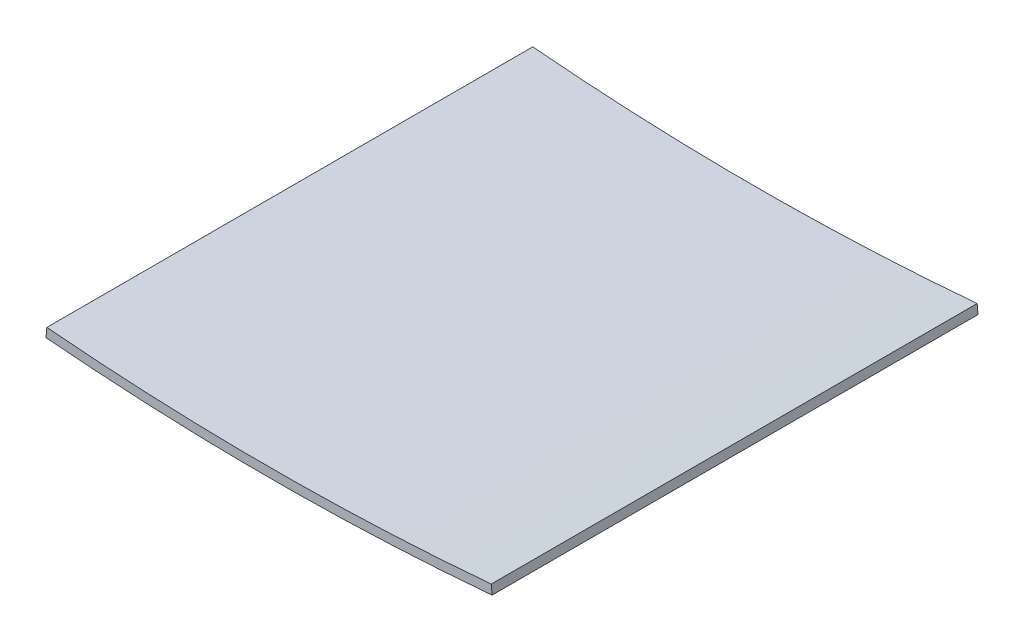
ISO-10303-21;
HEADER;
FILE_DESCRIPTION(('STEP AP214'),'2;1');
FILE_NAME('part.step','',(''),(''),'','','');
FILE_SCHEMA(('AUTOMOTIVE_DESIGN { 1 0 10303 214 1 1 1 1 }'));
ENDSEC;
DATA;
#1=APPLICATION_CONTEXT('core data for automotive mechanical design processes');
#2=APPLICATION_PROTOCOL_DEFINITION('international standard','automotive_design',2000,#1);
#3=PRODUCT_CONTEXT('',#1,'mechanical');
#4=PRODUCT('Part','Part','',(#3));
#5=PRODUCT_RELATED_PRODUCT_CATEGORY('part','',(#4));
#6=PRODUCT_DEFINITION_FORMATION('','',#4);
#7=PRODUCT_DEFINITION_CONTEXT('part definition',#1,'design');
#8=PRODUCT_DEFINITION('design','',#6,#7);
#9=PRODUCT_DEFINITION_SHAPE('','',#8);
#10=(LENGTH_UNIT() NAMED_UNIT(*) SI_UNIT(.MILLI.,.METRE.));
#11=(NAMED_UNIT(*) PLANE_ANGLE_UNIT() SI_UNIT($,.RADIAN.));
#12=(NAMED_UNIT(*) SI_UNIT($,.STERADIAN.) SOLID_ANGLE_UNIT());
#13=UNCERTAINTY_MEASURE_WITH_UNIT(LENGTH_MEASURE(1.E-05),#10,'distance_accuracy_value','');
#14=(GEOMETRIC_REPRESENTATION_CONTEXT(3) GLOBAL_UNCERTAINTY_ASSIGNED_CONTEXT((#13)) GLOBAL_UNIT_ASSIGNED_CONTEXT((#10,
#11,#12)) REPRESENTATION_CONTEXT('',''));
#15=CARTESIAN_POINT('',(0.,0.,0.));
#16=DIRECTION('',(0.,0.,1.));
#17=DIRECTION('',(1.,0.,0.));
#18=AXIS2_PLACEMENT_3D('',#15,#16,#17);
#19=CARTESIAN_POINT('',(0.,0.,105.));
#20=DIRECTION('',(0.,0.,-1.));
#21=DIRECTION('',(-1.,0.,0.));
#22=AXIS2_PLACEMENT_3D('',#19,#20,#21);
#23=CYLINDRICAL_SURFACE('',#22,553.);
#24=CARTESIAN_POINT('',(0.,0.,0.));
#25=DIRECTION('',(0.,0.,1.));
#26=DIRECTION('',(1.,0.,0.));
#27=AXIS2_PLACEMENT_3D('',#24,#25,#26);
#28=CIRCLE('',#27,553.);
#29=CARTESIAN_POINT('',(-48.197125739455,-550.895668044735,0.));
#30=VERTEX_POINT('',#29);
#31=CARTESIAN_POINT('',(48.1971257394548,-550.895668044735,0.));
#32=VERTEX_POINT('',#31);
#33=EDGE_CURVE('E101',#30,#32,#28,.T.);
#34=ORIENTED_EDGE('',*,*,#33,.T.);
#35=DIRECTION('',(0.,0.,-1.));
#36=VECTOR('',#35,1.);
#37=CARTESIAN_POINT('',(48.1971257394548,-550.895668044735,105.));
#38=LINE('',#37,#36);
#39=CARTESIAN_POINT('',(48.1971257394548,-550.895668044735,105.));
#40=VERTEX_POINT('',#39);
#41=EDGE_CURVE('E11',#40,#32,#38,.T.);
#42=ORIENTED_EDGE('',*,*,#41,.F.);
#43=CARTESIAN_POINT('',(0.,0.,105.));
#44=DIRECTION('',(0.,0.,1.));
#45=DIRECTION('',(1.,0.,0.));
#46=AXIS2_PLACEMENT_3D('',#43,#44,#45);
#47=CIRCLE('',#46,553.);
#48=CARTESIAN_POINT('',(-48.197125739455,-550.895668044735,105.));
#49=VERTEX_POINT('',#48);
#50=EDGE_CURVE('E78',#49,#40,#47,.T.);
#51=ORIENTED_EDGE('',*,*,#50,.F.);
#52=DIRECTION('',(0.,0.,-1.));
#53=VECTOR('',#52,1.);
#54=CARTESIAN_POINT('',(-48.197125739455,-550.895668044735,105.));
#55=LINE('',#54,#53);
#56=EDGE_CURVE('E54',#49,#30,#55,.T.);
#57=ORIENTED_EDGE('',*,*,#56,.T.);
#58=EDGE_LOOP('',(#34,#42,#51,#57));
#59=FACE_BOUND('',#58,.T.);
#60=ADVANCED_FACE('F38',(#59),#23,.T.);
#61=CARTESIAN_POINT('',(48.0228142539595,-548.903278648552,105.));
#62=DIRECTION('',(0.996194698091746,0.087155742747656,0.));
#63=DIRECTION('',(-0.087155742747656,0.996194698091746,0.));
#64=AXIS2_PLACEMENT_3D('',#61,#62,#63);
#65=PLANE('',#64);
#66=DIRECTION('',(0.087155742747656,-0.996194698091746,0.));
#67=VECTOR('',#66,1.);
#68=CARTESIAN_POINT('',(48.0228142539595,-548.903278648552,0.));
#69=LINE('',#68,#67);
#70=CARTESIAN_POINT('',(48.0228142539595,-548.903278648552,0.));
#71=VERTEX_POINT('',#70);
#72=EDGE_CURVE('E87',#71,#32,#69,.T.);
#73=ORIENTED_EDGE('',*,*,#72,.F.);
#74=DIRECTION('',(0.,0.,-1.));
#75=VECTOR('',#74,1.);
#76=CARTESIAN_POINT('',(48.0228142539595,-548.903278648552,105.));
#77=LINE('',#76,#75);
#78=CARTESIAN_POINT('',(48.0228142539595,-548.903278648552,105.));
#79=VERTEX_POINT('',#78);
#80=EDGE_CURVE('E46',#79,#71,#77,.T.);
#81=ORIENTED_EDGE('',*,*,#80,.F.);
#82=DIRECTION('',(0.087155742747656,-0.996194698091746,0.));
#83=VECTOR('',#82,1.);
#84=CARTESIAN_POINT('',(48.0228142539595,-548.903278648552,105.));
#85=LINE('',#84,#83);
#86=EDGE_CURVE('E85',#79,#40,#85,.T.);
#87=ORIENTED_EDGE('',*,*,#86,.T.);
#88=ORIENTED_EDGE('',*,*,#41,.T.);
#89=EDGE_LOOP('',(#73,#81,#87,#88));
#90=FACE_BOUND('',#89,.T.);
#91=ADVANCED_FACE('F84',(#90),#65,.T.);
#92=CARTESIAN_POINT('',(0.,0.,105.));
#93=DIRECTION('',(0.,0.,-1.));
#94=DIRECTION('',(-1.,0.,0.));
#95=AXIS2_PLACEMENT_3D('',#92,#93,#94);
#96=CYLINDRICAL_SURFACE('',#95,551.);
#97=CARTESIAN_POINT('',(0.,0.,0.));
#98=DIRECTION('',(0.,0.,1.));
#99=DIRECTION('',(1.,0.,0.));
#100=AXIS2_PLACEMENT_3D('',#97,#98,#99);
#101=CIRCLE('',#100,551.);
#102=CARTESIAN_POINT('',(-48.0228142539597,-548.903278648552,0.));
#103=VERTEX_POINT('',#102);
#104=EDGE_CURVE('E104',#103,#71,#101,.T.);
#105=ORIENTED_EDGE('',*,*,#104,.F.);
#106=DIRECTION('',(0.,0.,-1.));
#107=VECTOR('',#106,1.);
#108=CARTESIAN_POINT('',(-48.0228142539597,-548.903278648552,105.));
#109=LINE('',#108,#107);
#110=CARTESIAN_POINT('',(-48.0228142539597,-548.903278648552,105.));
#111=VERTEX_POINT('',#110);
#112=EDGE_CURVE('E67',#111,#103,#109,.T.);
#113=ORIENTED_EDGE('',*,*,#112,.F.);
#114=CARTESIAN_POINT('',(0.,0.,105.));
#115=DIRECTION('',(0.,0.,1.));
#116=DIRECTION('',(1.,0.,0.));
#117=AXIS2_PLACEMENT_3D('',#114,#115,#116);
#118=CIRCLE('',#117,551.);
#119=EDGE_CURVE('E93',#111,#79,#118,.T.);
#120=ORIENTED_EDGE('',*,*,#119,.T.);
#121=ORIENTED_EDGE('',*,*,#80,.T.);
#122=EDGE_LOOP('',(#105,#113,#120,#121));
#123=FACE_BOUND('',#122,.T.);
#124=ADVANCED_FACE('F95',(#123),#96,.F.);
#125=CARTESIAN_POINT('',(-48.197125739455,-550.895668044735,105.));
#126=DIRECTION('',(-0.996194698091746,0.087155742747656,0.));
#127=DIRECTION('',(-0.087155742747656,-0.996194698091746,0.));
#128=AXIS2_PLACEMENT_3D('',#125,#126,#127);
#129=PLANE('',#128);
#130=DIRECTION('',(0.087155742747656,0.996194698091746,0.));
#131=VECTOR('',#130,1.);
#132=CARTESIAN_POINT('',(-48.197125739455,-550.895668044735,0.));
#133=LINE('',#132,#131);
#134=EDGE_CURVE('E106',#30,#103,#133,.T.);
#135=ORIENTED_EDGE('',*,*,#134,.F.);
#136=ORIENTED_EDGE('',*,*,#56,.F.);
#137=DIRECTION('',(0.087155742747656,0.996194698091746,0.));
#138=VECTOR('',#137,1.);
#139=CARTESIAN_POINT('',(-48.197125739455,-550.895668044735,105.));
#140=LINE('',#139,#138);
#141=EDGE_CURVE('E96',#49,#111,#140,.T.);
#142=ORIENTED_EDGE('',*,*,#141,.T.);
#143=ORIENTED_EDGE('',*,*,#112,.T.);
#144=EDGE_LOOP('',(#135,#136,#142,#143));
#145=FACE_BOUND('',#144,.T.);
#146=ADVANCED_FACE('F112',(#145),#129,.T.);
#147=CARTESIAN_POINT('',(0.,0.,105.));
#148=DIRECTION('',(0.,0.,1.));
#149=DIRECTION('',(1.,0.,0.));
#150=AXIS2_PLACEMENT_3D('',#147,#148,#149);
#151=PLANE('',#150);
#152=ORIENTED_EDGE('',*,*,#50,.T.);
#153=ORIENTED_EDGE('',*,*,#86,.F.);
#154=ORIENTED_EDGE('',*,*,#119,.F.);
#155=ORIENTED_EDGE('',*,*,#141,.F.);
#156=EDGE_LOOP('',(#152,#153,#154,#155));
#157=FACE_BOUND('',#156,.T.);
#158=ADVANCED_FACE('F92',(#157),#151,.T.);
#159=CARTESIAN_POINT('',(0.,0.,0.));
#160=DIRECTION('',(0.,0.,1.));
#161=DIRECTION('',(1.,0.,0.));
#162=AXIS2_PLACEMENT_3D('',#159,#160,#161);
#163=PLANE('',#162);
#164=ORIENTED_EDGE('',*,*,#33,.F.);
#165=ORIENTED_EDGE('',*,*,#134,.T.);
#166=ORIENTED_EDGE('',*,*,#104,.T.);
#167=ORIENTED_EDGE('',*,*,#72,.T.);
#168=EDGE_LOOP('',(#164,#165,#166,#167));
#169=FACE_BOUND('',#168,.T.);
#170=ADVANCED_FACE('F111',(#169),#163,.F.);
#171=CLOSED_SHELL('',(#60,#91,#124,#146,#158,#170));
#172=MANIFOLD_SOLID_BREP('B2',#171);
#173=ADVANCED_BREP_SHAPE_REPRESENTATION('',(#18,#172),#14);
#174=SHAPE_DEFINITION_REPRESENTATION(#9,#173);
ENDSEC;
END-ISO-10303-21;
